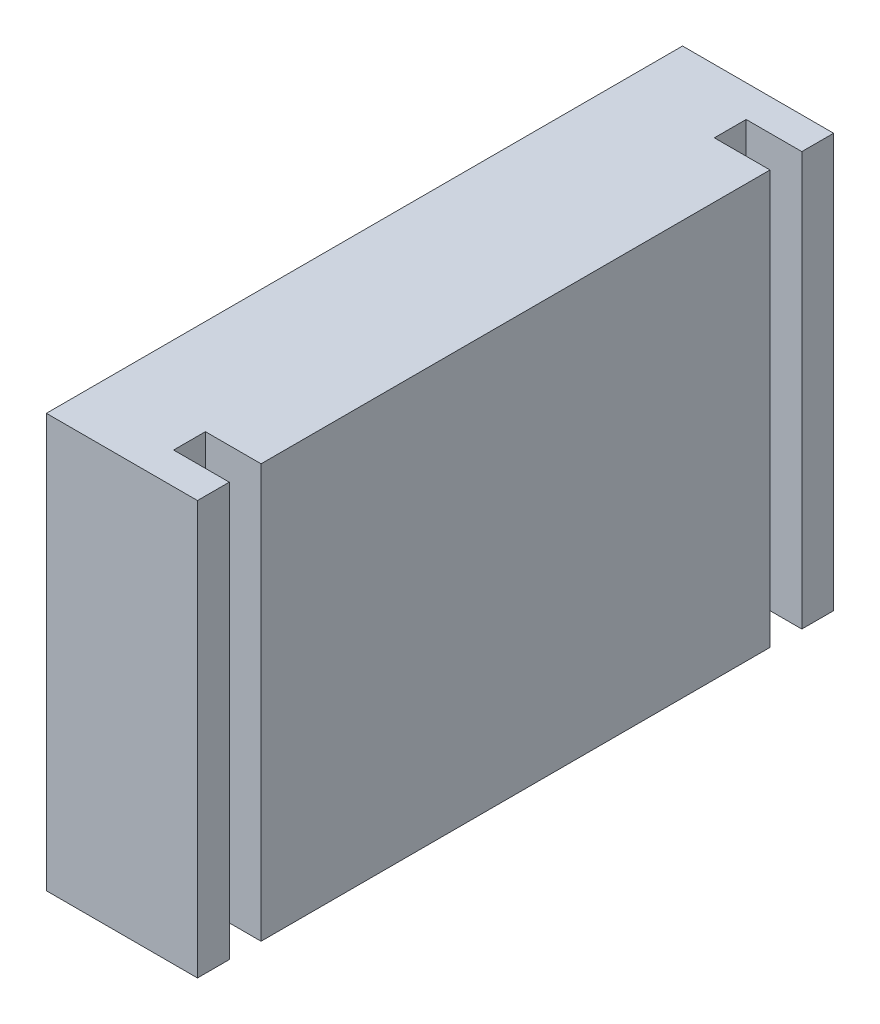
ISO-10303-21;
HEADER;
FILE_DESCRIPTION(('STEP AP214'),'2;1');
FILE_NAME('part.step','',(''),(''),'','','');
FILE_SCHEMA(('AUTOMOTIVE_DESIGN { 1 0 10303 214 1 1 1 1 }'));
ENDSEC;
DATA;
#1=APPLICATION_CONTEXT('core data for automotive mechanical design processes');
#2=APPLICATION_PROTOCOL_DEFINITION('international standard','automotive_design',2000,#1);
#3=PRODUCT_CONTEXT('',#1,'mechanical');
#4=PRODUCT('Part','Part','',(#3));
#5=PRODUCT_RELATED_PRODUCT_CATEGORY('part','',(#4));
#6=PRODUCT_DEFINITION_FORMATION('','',#4);
#7=PRODUCT_DEFINITION_CONTEXT('part definition',#1,'design');
#8=PRODUCT_DEFINITION('design','',#6,#7);
#9=PRODUCT_DEFINITION_SHAPE('','',#8);
#10=(LENGTH_UNIT() NAMED_UNIT(*) SI_UNIT(.MILLI.,.METRE.));
#11=(NAMED_UNIT(*) PLANE_ANGLE_UNIT() SI_UNIT($,.RADIAN.));
#12=(NAMED_UNIT(*) SI_UNIT($,.STERADIAN.) SOLID_ANGLE_UNIT());
#13=UNCERTAINTY_MEASURE_WITH_UNIT(LENGTH_MEASURE(1.E-05),#10,'distance_accuracy_value','');
#14=(GEOMETRIC_REPRESENTATION_CONTEXT(3) GLOBAL_UNCERTAINTY_ASSIGNED_CONTEXT((#13)) GLOBAL_UNIT_ASSIGNED_CONTEXT((#10,
#11,#12)) REPRESENTATION_CONTEXT('',''));
#15=CARTESIAN_POINT('',(0.,0.,0.));
#16=DIRECTION('',(0.,0.,1.));
#17=DIRECTION('',(1.,0.,0.));
#18=AXIS2_PLACEMENT_3D('',#15,#16,#17);
#19=CARTESIAN_POINT('',(-12.7136711057762,10.,-38.3585483079557));
#20=DIRECTION('',(0.,0.,-1.));
#21=DIRECTION('',(-1.,0.,0.));
#22=AXIS2_PLACEMENT_3D('',#19,#20,#21);
#23=PLANE('',#22);
#24=DIRECTION('',(0.,-1.,0.));
#25=VECTOR('',#24,1.);
#26=CARTESIAN_POINT('',(-10.9636711057761,10.,-38.3585483079557));
#27=LINE('',#26,#25);
#28=CARTESIAN_POINT('',(-10.9636711057761,8.,-38.3585483079557));
#29=VERTEX_POINT('',#28);
#30=CARTESIAN_POINT('',(-10.9636711057761,-5.,-38.3585483079557));
#31=VERTEX_POINT('',#30);
#32=EDGE_CURVE('E57',#29,#31,#27,.T.);
#33=ORIENTED_EDGE('',*,*,#32,.F.);
#34=DIRECTION('',(1.,0.,0.));
#35=VECTOR('',#34,1.);
#36=CARTESIAN_POINT('',(-12.7136711057762,8.,-38.3585483079557));
#37=LINE('',#36,#35);
#38=CARTESIAN_POINT('',(-12.7136711057762,8.,-38.3585483079557));
#39=VERTEX_POINT('',#38);
#40=EDGE_CURVE('E186',#39,#29,#37,.T.);
#41=ORIENTED_EDGE('',*,*,#40,.F.);
#42=DIRECTION('',(0.,-1.,0.));
#43=VECTOR('',#42,1.);
#44=CARTESIAN_POINT('',(-12.7136711057762,10.,-38.3585483079557));
#45=LINE('',#44,#43);
#46=CARTESIAN_POINT('',(-12.7136711057762,-5.,-38.3585483079557));
#47=VERTEX_POINT('',#46);
#48=EDGE_CURVE('E201',#39,#47,#45,.T.);
#49=ORIENTED_EDGE('',*,*,#48,.T.);
#50=DIRECTION('',(-1.,0.,0.));
#51=VECTOR('',#50,1.);
#52=CARTESIAN_POINT('',(-10.7136711057762,-5.,-38.3585483079557));
#53=LINE('',#52,#51);
#54=EDGE_CURVE('E160',#31,#47,#53,.T.);
#55=ORIENTED_EDGE('',*,*,#54,.F.);
#56=EDGE_LOOP('',(#33,#41,#49,#55));
#57=FACE_BOUND('',#56,.T.);
#58=ADVANCED_FACE('F33',(#57),#23,.F.);
#59=CARTESIAN_POINT('',(-10.7136711057762,10.,-39.3585483079557));
#60=DIRECTION('',(0.,0.,1.));
#61=DIRECTION('',(1.,0.,0.));
#62=AXIS2_PLACEMENT_3D('',#59,#60,#61);
#63=PLANE('',#62);
#64=DIRECTION('',(0.,1.,0.));
#65=VECTOR('',#64,1.);
#66=CARTESIAN_POINT('',(-10.9636711057761,10.,-39.3585483079557));
#67=LINE('',#66,#65);
#68=CARTESIAN_POINT('',(-10.9636711057761,-5.,-39.3585483079557));
#69=VERTEX_POINT('',#68);
#70=CARTESIAN_POINT('',(-10.9636711057761,8.,-39.3585483079557));
#71=VERTEX_POINT('',#70);
#72=EDGE_CURVE('E228',#69,#71,#67,.T.);
#73=ORIENTED_EDGE('',*,*,#72,.F.);
#74=DIRECTION('',(1.,0.,0.));
#75=VECTOR('',#74,1.);
#76=CARTESIAN_POINT('',(-15.7136711057762,-5.,-39.3585483079557));
#77=LINE('',#76,#75);
#78=CARTESIAN_POINT('',(-15.7136711057762,-5.,-39.3585483079557));
#79=VERTEX_POINT('',#78);
#80=EDGE_CURVE('E158',#79,#69,#77,.T.);
#81=ORIENTED_EDGE('',*,*,#80,.F.);
#82=DIRECTION('',(0.,-1.,0.));
#83=VECTOR('',#82,1.);
#84=CARTESIAN_POINT('',(-15.7136711057762,10.,-39.3585483079557));
#85=LINE('',#84,#83);
#86=CARTESIAN_POINT('',(-15.7136711057762,8.,-39.3585483079557));
#87=VERTEX_POINT('',#86);
#88=EDGE_CURVE('E199',#87,#79,#85,.T.);
#89=ORIENTED_EDGE('',*,*,#88,.F.);
#90=DIRECTION('',(-1.,0.,0.));
#91=VECTOR('',#90,1.);
#92=CARTESIAN_POINT('',(-15.7136711057762,8.,-39.3585483079557));
#93=LINE('',#92,#91);
#94=EDGE_CURVE('E176',#71,#87,#93,.T.);
#95=ORIENTED_EDGE('',*,*,#94,.F.);
#96=EDGE_LOOP('',(#73,#81,#89,#95));
#97=FACE_BOUND('',#96,.T.);
#98=ADVANCED_FACE('F226',(#97),#63,.F.);
#99=CARTESIAN_POINT('',(-15.7136711057761,10.,-19.3585483079557));
#100=DIRECTION('',(0.,0.,-1.));
#101=DIRECTION('',(-1.,0.,0.));
#102=AXIS2_PLACEMENT_3D('',#99,#100,#101);
#103=PLANE('',#102);
#104=DIRECTION('',(0.,-1.,0.));
#105=VECTOR('',#104,1.);
#106=CARTESIAN_POINT('',(-10.9636711057761,10.,-19.3585483079557));
#107=LINE('',#106,#105);
#108=CARTESIAN_POINT('',(-10.9636711057761,8.,-19.3585483079557));
#109=VERTEX_POINT('',#108);
#110=CARTESIAN_POINT('',(-10.9636711057761,-5.,-19.3585483079557));
#111=VERTEX_POINT('',#110);
#112=EDGE_CURVE('E126',#109,#111,#107,.T.);
#113=ORIENTED_EDGE('',*,*,#112,.F.);
#114=DIRECTION('',(1.,0.,0.));
#115=VECTOR('',#114,1.);
#116=CARTESIAN_POINT('',(-15.7136711057762,8.,-19.3585483079557));
#117=LINE('',#116,#115);
#118=CARTESIAN_POINT('',(-15.7136711057762,8.,-19.3585483079557));
#119=VERTEX_POINT('',#118);
#120=EDGE_CURVE('E173',#119,#109,#117,.T.);
#121=ORIENTED_EDGE('',*,*,#120,.F.);
#122=DIRECTION('',(0.,-1.,0.));
#123=VECTOR('',#122,1.);
#124=CARTESIAN_POINT('',(-15.7136711057761,10.,-19.3585483079557));
#125=LINE('',#124,#123);
#126=CARTESIAN_POINT('',(-15.7136711057761,-5.,-19.3585483079557));
#127=VERTEX_POINT('',#126);
#128=EDGE_CURVE('E196',#119,#127,#125,.T.);
#129=ORIENTED_EDGE('',*,*,#128,.T.);
#130=DIRECTION('',(-1.,0.,0.));
#131=VECTOR('',#130,1.);
#132=CARTESIAN_POINT('',(-10.7136711057762,-5.,-19.3585483079557));
#133=LINE('',#132,#131);
#134=EDGE_CURVE('E144',#111,#127,#133,.T.);
#135=ORIENTED_EDGE('',*,*,#134,.F.);
#136=EDGE_LOOP('',(#113,#121,#129,#135));
#137=FACE_BOUND('',#136,.T.);
#138=ADVANCED_FACE('F235',(#137),#103,.F.);
#139=CARTESIAN_POINT('',(-10.7136711057761,10.,-20.3585483079557));
#140=DIRECTION('',(0.,0.,1.));
#141=DIRECTION('',(1.,0.,0.));
#142=AXIS2_PLACEMENT_3D('',#139,#140,#141);
#143=PLANE('',#142);
#144=DIRECTION('',(0.,1.,0.));
#145=VECTOR('',#144,1.);
#146=CARTESIAN_POINT('',(-10.9636711057761,10.,-20.3585483079557));
#147=LINE('',#146,#145);
#148=CARTESIAN_POINT('',(-10.9636711057761,-5.,-20.3585483079557));
#149=VERTEX_POINT('',#148);
#150=CARTESIAN_POINT('',(-10.9636711057761,8.,-20.3585483079557));
#151=VERTEX_POINT('',#150);
#152=EDGE_CURVE('E123',#149,#151,#147,.T.);
#153=ORIENTED_EDGE('',*,*,#152,.F.);
#154=DIRECTION('',(1.,0.,0.));
#155=VECTOR('',#154,1.);
#156=CARTESIAN_POINT('',(-12.7136711057761,-5.,-20.3585483079557));
#157=LINE('',#156,#155);
#158=CARTESIAN_POINT('',(-12.7136711057761,-5.,-20.3585483079557));
#159=VERTEX_POINT('',#158);
#160=EDGE_CURVE('E136',#159,#149,#157,.T.);
#161=ORIENTED_EDGE('',*,*,#160,.F.);
#162=DIRECTION('',(0.,-1.,0.));
#163=VECTOR('',#162,1.);
#164=CARTESIAN_POINT('',(-12.7136711057761,10.,-20.3585483079557));
#165=LINE('',#164,#163);
#166=CARTESIAN_POINT('',(-12.7136711057761,8.,-20.3585483079557));
#167=VERTEX_POINT('',#166);
#168=EDGE_CURVE('E194',#167,#159,#165,.T.);
#169=ORIENTED_EDGE('',*,*,#168,.F.);
#170=DIRECTION('',(-1.,0.,0.));
#171=VECTOR('',#170,1.);
#172=CARTESIAN_POINT('',(-10.7136711057761,8.,-20.3585483079557));
#173=LINE('',#172,#171);
#174=EDGE_CURVE('E137',#151,#167,#173,.T.);
#175=ORIENTED_EDGE('',*,*,#174,.F.);
#176=EDGE_LOOP('',(#153,#161,#169,#175));
#177=FACE_BOUND('',#176,.T.);
#178=ADVANCED_FACE('F134',(#177),#143,.F.);
#179=CARTESIAN_POINT('',(-12.7136711057761,10.,-21.3585483079557));
#180=DIRECTION('',(0.,0.,-1.));
#181=DIRECTION('',(-1.,0.,0.));
#182=AXIS2_PLACEMENT_3D('',#179,#180,#181);
#183=PLANE('',#182);
#184=DIRECTION('',(0.,-1.,0.));
#185=VECTOR('',#184,1.);
#186=CARTESIAN_POINT('',(-10.9636711057761,10.,-21.3585483079557));
#187=LINE('',#186,#185);
#188=CARTESIAN_POINT('',(-10.9636711057761,8.,-21.3585483079557));
#189=VERTEX_POINT('',#188);
#190=CARTESIAN_POINT('',(-10.9636711057761,-5.,-21.3585483079557));
#191=VERTEX_POINT('',#190);
#192=EDGE_CURVE('E49',#189,#191,#187,.T.);
#193=ORIENTED_EDGE('',*,*,#192,.F.);
#194=DIRECTION('',(1.,0.,0.));
#195=VECTOR('',#194,1.);
#196=CARTESIAN_POINT('',(-12.7136711057761,8.,-21.3585483079557));
#197=LINE('',#196,#195);
#198=CARTESIAN_POINT('',(-12.7136711057761,8.,-21.3585483079557));
#199=VERTEX_POINT('',#198);
#200=EDGE_CURVE('E178',#199,#189,#197,.T.);
#201=ORIENTED_EDGE('',*,*,#200,.F.);
#202=DIRECTION('',(0.,-1.,0.));
#203=VECTOR('',#202,1.);
#204=CARTESIAN_POINT('',(-12.7136711057761,10.,-21.3585483079557));
#205=LINE('',#204,#203);
#206=CARTESIAN_POINT('',(-12.7136711057761,-5.,-21.3585483079557));
#207=VERTEX_POINT('',#206);
#208=EDGE_CURVE('E191',#199,#207,#205,.T.);
#209=ORIENTED_EDGE('',*,*,#208,.T.);
#210=DIRECTION('',(-1.,0.,0.));
#211=VECTOR('',#210,1.);
#212=CARTESIAN_POINT('',(-10.7176964580233,-5.,-21.3585483079557));
#213=LINE('',#212,#211);
#214=EDGE_CURVE('E168',#191,#207,#213,.T.);
#215=ORIENTED_EDGE('',*,*,#214,.F.);
#216=EDGE_LOOP('',(#193,#201,#209,#215));
#217=FACE_BOUND('',#216,.T.);
#218=ADVANCED_FACE('F262',(#217),#183,.F.);
#219=CARTESIAN_POINT('',(-12.7136711057762,10.,-37.3585483079557));
#220=DIRECTION('',(0.,0.,1.));
#221=DIRECTION('',(1.,0.,0.));
#222=AXIS2_PLACEMENT_3D('',#219,#220,#221);
#223=PLANE('',#222);
#224=DIRECTION('',(0.,1.,0.));
#225=VECTOR('',#224,1.);
#226=CARTESIAN_POINT('',(-10.9636711057761,10.,-37.3585483079557));
#227=LINE('',#226,#225);
#228=CARTESIAN_POINT('',(-10.9636711057761,-5.,-37.3585483079557));
#229=VERTEX_POINT('',#228);
#230=CARTESIAN_POINT('',(-10.9636711057761,8.,-37.3585483079557));
#231=VERTEX_POINT('',#230);
#232=EDGE_CURVE('E217',#229,#231,#227,.T.);
#233=ORIENTED_EDGE('',*,*,#232,.F.);
#234=DIRECTION('',(1.,0.,0.));
#235=VECTOR('',#234,1.);
#236=CARTESIAN_POINT('',(-12.7136711057762,-5.,-37.3585483079557));
#237=LINE('',#236,#235);
#238=CARTESIAN_POINT('',(-12.7136711057762,-5.,-37.3585483079557));
#239=VERTEX_POINT('',#238);
#240=EDGE_CURVE('E165',#239,#229,#237,.T.);
#241=ORIENTED_EDGE('',*,*,#240,.F.);
#242=DIRECTION('',(0.,-1.,0.));
#243=VECTOR('',#242,1.);
#244=CARTESIAN_POINT('',(-12.7136711057762,10.,-37.3585483079557));
#245=LINE('',#244,#243);
#246=CARTESIAN_POINT('',(-12.7136711057762,8.,-37.3585483079557));
#247=VERTEX_POINT('',#246);
#248=EDGE_CURVE('E189',#247,#239,#245,.T.);
#249=ORIENTED_EDGE('',*,*,#248,.F.);
#250=DIRECTION('',(-1.,0.,0.));
#251=VECTOR('',#250,1.);
#252=CARTESIAN_POINT('',(-12.7136711057762,8.,-37.3585483079557));
#253=LINE('',#252,#251);
#254=EDGE_CURVE('E130',#231,#247,#253,.T.);
#255=ORIENTED_EDGE('',*,*,#254,.F.);
#256=EDGE_LOOP('',(#233,#241,#249,#255));
#257=FACE_BOUND('',#256,.T.);
#258=ADVANCED_FACE('F216',(#257),#223,.F.);
#259=CARTESIAN_POINT('',(0.,8.,0.));
#260=DIRECTION('',(0.,1.,0.));
#261=DIRECTION('',(0.,0.,1.));
#262=AXIS2_PLACEMENT_3D('',#259,#260,#261);
#263=PLANE('',#262);
#264=ORIENTED_EDGE('',*,*,#120,.T.);
#265=DIRECTION('',(0.,0.,-1.));
#266=VECTOR('',#265,1.);
#267=CARTESIAN_POINT('',(-10.9636711057761,8.,0.));
#268=LINE('',#267,#266);
#269=EDGE_CURVE('E152',#109,#151,#268,.T.);
#270=ORIENTED_EDGE('',*,*,#269,.T.);
#271=ORIENTED_EDGE('',*,*,#174,.T.);
#272=DIRECTION('',(0.,0.,-1.));
#273=VECTOR('',#272,1.);
#274=CARTESIAN_POINT('',(-12.7136711057761,8.,-20.3585483079557));
#275=LINE('',#274,#273);
#276=EDGE_CURVE('E181',#167,#199,#275,.T.);
#277=ORIENTED_EDGE('',*,*,#276,.T.);
#278=ORIENTED_EDGE('',*,*,#200,.T.);
#279=EDGE_CURVE('E151',#189,#231,#268,.T.);
#280=ORIENTED_EDGE('',*,*,#279,.T.);
#281=ORIENTED_EDGE('',*,*,#254,.T.);
#282=DIRECTION('',(0.,0.,-1.));
#283=VECTOR('',#282,1.);
#284=CARTESIAN_POINT('',(-12.7136711057762,8.,-38.3585483079557));
#285=LINE('',#284,#283);
#286=EDGE_CURVE('E184',#247,#39,#285,.T.);
#287=ORIENTED_EDGE('',*,*,#286,.T.);
#288=ORIENTED_EDGE('',*,*,#40,.T.);
#289=EDGE_CURVE('E145',#29,#71,#268,.T.);
#290=ORIENTED_EDGE('',*,*,#289,.T.);
#291=ORIENTED_EDGE('',*,*,#94,.T.);
#292=DIRECTION('',(0.,0.,1.));
#293=VECTOR('',#292,1.);
#294=CARTESIAN_POINT('',(-15.7136711057762,8.,-39.3585483079557));
#295=LINE('',#294,#293);
#296=EDGE_CURVE('E171',#87,#119,#295,.T.);
#297=ORIENTED_EDGE('',*,*,#296,.T.);
#298=EDGE_LOOP('',(#264,#270,#271,#277,#278,#280,#281,#287,#288,#290,#291,#297));
#299=FACE_BOUND('',#298,.T.);
#300=ADVANCED_FACE('F207',(#299),#263,.T.);
#301=CARTESIAN_POINT('',(0.,-5.,0.));
#302=DIRECTION('',(0.,-1.,0.));
#303=DIRECTION('',(0.,0.,-1.));
#304=AXIS2_PLACEMENT_3D('',#301,#302,#303);
#305=PLANE('',#304);
#306=ORIENTED_EDGE('',*,*,#80,.T.);
#307=DIRECTION('',(0.,0.,1.));
#308=VECTOR('',#307,1.);
#309=CARTESIAN_POINT('',(-10.9636711057761,-5.,0.));
#310=LINE('',#309,#308);
#311=EDGE_CURVE('E11',#69,#31,#310,.T.);
#312=ORIENTED_EDGE('',*,*,#311,.T.);
#313=ORIENTED_EDGE('',*,*,#54,.T.);
#314=DIRECTION('',(0.,0.,1.));
#315=VECTOR('',#314,1.);
#316=CARTESIAN_POINT('',(-12.7136711057762,-5.,-38.3585483079557));
#317=LINE('',#316,#315);
#318=EDGE_CURVE('E162',#47,#239,#317,.T.);
#319=ORIENTED_EDGE('',*,*,#318,.T.);
#320=ORIENTED_EDGE('',*,*,#240,.T.);
#321=EDGE_CURVE('E42',#229,#191,#310,.T.);
#322=ORIENTED_EDGE('',*,*,#321,.T.);
#323=ORIENTED_EDGE('',*,*,#214,.T.);
#324=DIRECTION('',(0.,0.,1.));
#325=VECTOR('',#324,1.);
#326=CARTESIAN_POINT('',(-12.7136711057761,-5.,-21.3585483079557));
#327=LINE('',#326,#325);
#328=EDGE_CURVE('E143',#207,#159,#327,.T.);
#329=ORIENTED_EDGE('',*,*,#328,.T.);
#330=ORIENTED_EDGE('',*,*,#160,.T.);
#331=EDGE_CURVE('E37',#149,#111,#310,.T.);
#332=ORIENTED_EDGE('',*,*,#331,.T.);
#333=ORIENTED_EDGE('',*,*,#134,.T.);
#334=DIRECTION('',(0.,0.,-1.));
#335=VECTOR('',#334,1.);
#336=CARTESIAN_POINT('',(-15.7136711057761,-5.,-19.3585483079557));
#337=LINE('',#336,#335);
#338=EDGE_CURVE('E147',#127,#79,#337,.T.);
#339=ORIENTED_EDGE('',*,*,#338,.T.);
#340=EDGE_LOOP('',(#306,#312,#313,#319,#320,#322,#323,#329,#330,#332,#333,#339));
#341=FACE_BOUND('',#340,.T.);
#342=ADVANCED_FACE('F141',(#341),#305,.T.);
#343=CARTESIAN_POINT('',(-12.7136711057762,10.,-38.3585483079557));
#344=DIRECTION('',(-1.,0.,0.));
#345=DIRECTION('',(0.,0.,1.));
#346=AXIS2_PLACEMENT_3D('',#343,#344,#345);
#347=PLANE('',#346);
#348=ORIENTED_EDGE('',*,*,#248,.T.);
#349=ORIENTED_EDGE('',*,*,#318,.F.);
#350=ORIENTED_EDGE('',*,*,#48,.F.);
#351=ORIENTED_EDGE('',*,*,#286,.F.);
#352=EDGE_LOOP('',(#348,#349,#350,#351));
#353=FACE_BOUND('',#352,.T.);
#354=ADVANCED_FACE('F35',(#353),#347,.F.);
#355=CARTESIAN_POINT('',(-15.7136711057762,10.,-39.3585483079557));
#356=DIRECTION('',(1.,0.,0.));
#357=DIRECTION('',(0.,0.,-1.));
#358=AXIS2_PLACEMENT_3D('',#355,#356,#357);
#359=PLANE('',#358);
#360=ORIENTED_EDGE('',*,*,#88,.T.);
#361=ORIENTED_EDGE('',*,*,#338,.F.);
#362=ORIENTED_EDGE('',*,*,#128,.F.);
#363=ORIENTED_EDGE('',*,*,#296,.F.);
#364=EDGE_LOOP('',(#360,#361,#362,#363));
#365=FACE_BOUND('',#364,.T.);
#366=ADVANCED_FACE('F231',(#365),#359,.F.);
#367=CARTESIAN_POINT('',(-12.7136711057761,10.,-20.3585483079557));
#368=DIRECTION('',(-1.,0.,0.));
#369=DIRECTION('',(0.,0.,1.));
#370=AXIS2_PLACEMENT_3D('',#367,#368,#369);
#371=PLANE('',#370);
#372=ORIENTED_EDGE('',*,*,#168,.T.);
#373=ORIENTED_EDGE('',*,*,#328,.F.);
#374=ORIENTED_EDGE('',*,*,#208,.F.);
#375=ORIENTED_EDGE('',*,*,#276,.F.);
#376=EDGE_LOOP('',(#372,#373,#374,#375));
#377=FACE_BOUND('',#376,.T.);
#378=ADVANCED_FACE('F249',(#377),#371,.F.);
#379=CARTESIAN_POINT('',(-10.9636711057761,0.,0.));
#380=DIRECTION('',(1.,0.,0.));
#381=DIRECTION('',(0.,0.,-1.));
#382=AXIS2_PLACEMENT_3D('',#379,#380,#381);
#383=PLANE('',#382);
#384=ORIENTED_EDGE('',*,*,#112,.T.);
#385=ORIENTED_EDGE('',*,*,#331,.F.);
#386=ORIENTED_EDGE('',*,*,#152,.T.);
#387=ORIENTED_EDGE('',*,*,#269,.F.);
#388=EDGE_LOOP('',(#384,#385,#386,#387));
#389=FACE_BOUND('',#388,.T.);
#390=ADVANCED_FACE('F122',(#389),#383,.T.);
#391=ORIENTED_EDGE('',*,*,#192,.T.);
#392=ORIENTED_EDGE('',*,*,#321,.F.);
#393=ORIENTED_EDGE('',*,*,#232,.T.);
#394=ORIENTED_EDGE('',*,*,#279,.F.);
#395=EDGE_LOOP('',(#391,#392,#393,#394));
#396=FACE_BOUND('',#395,.T.);
#397=ADVANCED_FACE('F242',(#396),#383,.T.);
#398=ORIENTED_EDGE('',*,*,#32,.T.);
#399=ORIENTED_EDGE('',*,*,#311,.F.);
#400=ORIENTED_EDGE('',*,*,#72,.T.);
#401=ORIENTED_EDGE('',*,*,#289,.F.);
#402=EDGE_LOOP('',(#398,#399,#400,#401));
#403=FACE_BOUND('',#402,.T.);
#404=ADVANCED_FACE('F240',(#403),#383,.T.);
#405=CLOSED_SHELL('',(#58,#98,#138,#178,#218,#258,#300,#342,#354,#366,#378,#390,#397,#404));
#406=MANIFOLD_SOLID_BREP('B2',#405);
#407=ADVANCED_BREP_SHAPE_REPRESENTATION('',(#18,#406),#14);
#408=SHAPE_DEFINITION_REPRESENTATION(#9,#407);
ENDSEC;
END-ISO-10303-21;
